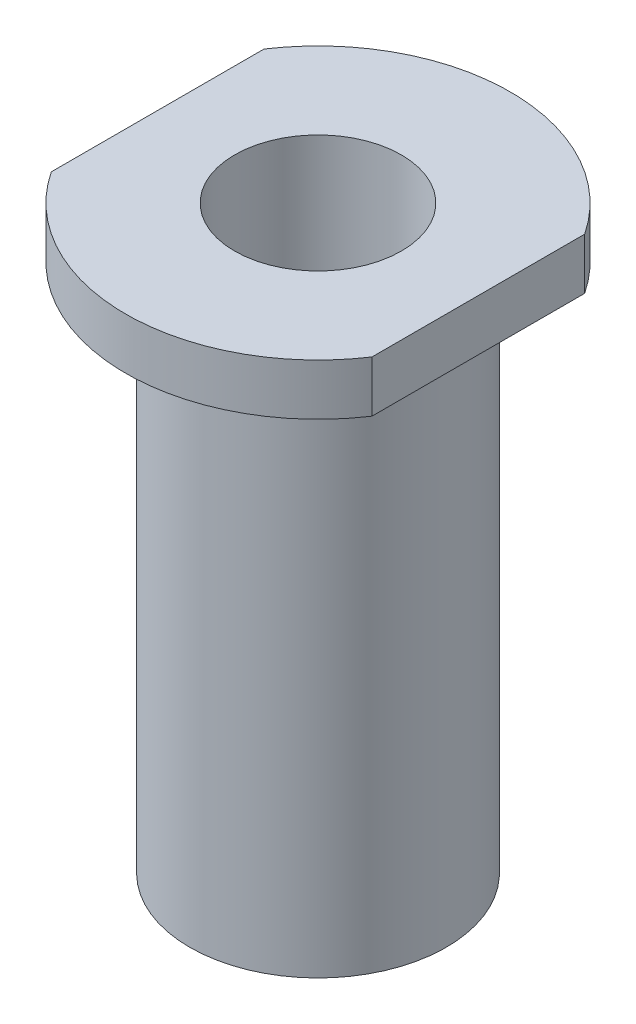
ISO-10303-21;
HEADER;
FILE_DESCRIPTION(('STEP AP214'),'2;1');
FILE_NAME('part.step','',(''),(''),'','','');
FILE_SCHEMA(('AUTOMOTIVE_DESIGN { 1 0 10303 214 1 1 1 1 }'));
ENDSEC;
DATA;
#1=APPLICATION_CONTEXT('core data for automotive mechanical design processes');
#2=APPLICATION_PROTOCOL_DEFINITION('international standard','automotive_design',2000,#1);
#3=PRODUCT_CONTEXT('',#1,'mechanical');
#4=PRODUCT('Part','Part','',(#3));
#5=PRODUCT_RELATED_PRODUCT_CATEGORY('part','',(#4));
#6=PRODUCT_DEFINITION_FORMATION('','',#4);
#7=PRODUCT_DEFINITION_CONTEXT('part definition',#1,'design');
#8=PRODUCT_DEFINITION('design','',#6,#7);
#9=PRODUCT_DEFINITION_SHAPE('','',#8);
#10=(LENGTH_UNIT() NAMED_UNIT(*) SI_UNIT(.MILLI.,.METRE.));
#11=(NAMED_UNIT(*) PLANE_ANGLE_UNIT() SI_UNIT($,.RADIAN.));
#12=(NAMED_UNIT(*) SI_UNIT($,.STERADIAN.) SOLID_ANGLE_UNIT());
#13=UNCERTAINTY_MEASURE_WITH_UNIT(LENGTH_MEASURE(1.E-05),#10,'distance_accuracy_value','');
#14=(GEOMETRIC_REPRESENTATION_CONTEXT(3) GLOBAL_UNCERTAINTY_ASSIGNED_CONTEXT((#13)) GLOBAL_UNIT_ASSIGNED_CONTEXT((#10,
#11,#12)) REPRESENTATION_CONTEXT('',''));
#15=CARTESIAN_POINT('',(0.,0.,0.));
#16=DIRECTION('',(0.,0.,1.));
#17=DIRECTION('',(1.,0.,0.));
#18=AXIS2_PLACEMENT_3D('',#15,#16,#17);
#19=CARTESIAN_POINT('',(0.,22.63,0.));
#20=DIRECTION('',(0.,-1.,0.));
#21=DIRECTION('',(0.,0.,-1.));
#22=AXIS2_PLACEMENT_3D('',#19,#20,#21);
#23=CYLINDRICAL_SURFACE('',#22,5.);
#24=CARTESIAN_POINT('',(0.,0.,0.));
#25=DIRECTION('',(0.,1.,0.));
#26=DIRECTION('',(0.,0.,1.));
#27=AXIS2_PLACEMENT_3D('',#24,#25,#26);
#28=CIRCLE('',#27,5.);
#29=CARTESIAN_POINT('',(0.,0.,5.));
#30=VERTEX_POINT('',#29);
#31=EDGE_CURVE('E54',#30,#30,#28,.T.);
#32=ORIENTED_EDGE('',*,*,#31,.T.);
#33=EDGE_LOOP('',(#32));
#34=FACE_BOUND('',#33,.T.);
#35=CARTESIAN_POINT('',(0.,20.63,0.));
#36=DIRECTION('',(0.,1.,0.));
#37=DIRECTION('',(0.,0.,1.));
#38=AXIS2_PLACEMENT_3D('',#35,#36,#37);
#39=CIRCLE('',#38,5.);
#40=CARTESIAN_POINT('',(0.,20.63,5.));
#41=VERTEX_POINT('',#40);
#42=EDGE_CURVE('E12',#41,#41,#39,.T.);
#43=ORIENTED_EDGE('',*,*,#42,.F.);
#44=EDGE_LOOP('',(#43));
#45=FACE_BOUND('',#44,.T.);
#46=ADVANCED_FACE('F45',(#34,#45),#23,.T.);
#47=CARTESIAN_POINT('',(0.,22.63,0.));
#48=DIRECTION('',(0.,1.,0.));
#49=DIRECTION('',(0.,0.,1.));
#50=AXIS2_PLACEMENT_3D('',#47,#48,#49);
#51=PLANE('',#50);
#52=CARTESIAN_POINT('',(0.,22.63,0.));
#53=DIRECTION('',(0.,1.,0.));
#54=DIRECTION('',(0.,0.,1.));
#55=AXIS2_PLACEMENT_3D('',#52,#53,#54);
#56=CIRCLE('',#55,3.25);
#57=CARTESIAN_POINT('',(0.,22.63,3.25));
#58=VERTEX_POINT('',#57);
#59=EDGE_CURVE('E152',#58,#58,#56,.T.);
#60=ORIENTED_EDGE('',*,*,#59,.F.);
#61=EDGE_LOOP('',(#60));
#62=FACE_BOUND('',#61,.T.);
#63=CARTESIAN_POINT('',(0.,22.63,0.));
#64=DIRECTION('',(0.,1.,0.));
#65=DIRECTION('',(0.,0.,1.));
#66=AXIS2_PLACEMENT_3D('',#63,#64,#65);
#67=CIRCLE('',#66,7.5);
#68=CARTESIAN_POINT('',(6.25,22.63,-4.14578098794425));
#69=VERTEX_POINT('',#68);
#70=CARTESIAN_POINT('',(-6.25,22.63,-4.14578098794425));
#71=VERTEX_POINT('',#70);
#72=EDGE_CURVE('E118',#69,#71,#67,.T.);
#73=ORIENTED_EDGE('',*,*,#72,.T.);
#74=DIRECTION('',(0.,0.,1.));
#75=VECTOR('',#74,1.);
#76=CARTESIAN_POINT('',(-6.25,22.63,4.14578098794425));
#77=LINE('',#76,#75);
#78=CARTESIAN_POINT('',(-6.25,22.63,4.14578098794425));
#79=VERTEX_POINT('',#78);
#80=EDGE_CURVE('E122',#71,#79,#77,.T.);
#81=ORIENTED_EDGE('',*,*,#80,.T.);
#82=CARTESIAN_POINT('',(0.,22.63,0.));
#83=DIRECTION('',(0.,1.,0.));
#84=DIRECTION('',(0.,0.,1.));
#85=AXIS2_PLACEMENT_3D('',#82,#83,#84);
#86=CIRCLE('',#85,7.5);
#87=CARTESIAN_POINT('',(6.25,22.63,4.14578098794425));
#88=VERTEX_POINT('',#87);
#89=EDGE_CURVE('E98',#79,#88,#86,.T.);
#90=ORIENTED_EDGE('',*,*,#89,.T.);
#91=DIRECTION('',(0.,0.,-1.));
#92=VECTOR('',#91,1.);
#93=CARTESIAN_POINT('',(6.25,22.63,4.14578098794425));
#94=LINE('',#93,#92);
#95=EDGE_CURVE('E113',#88,#69,#94,.T.);
#96=ORIENTED_EDGE('',*,*,#95,.T.);
#97=EDGE_LOOP('',(#73,#81,#90,#96));
#98=FACE_BOUND('',#97,.T.);
#99=ADVANCED_FACE('F168',(#62,#98),#51,.T.);
#100=CARTESIAN_POINT('',(0.,0.,0.));
#101=DIRECTION('',(0.,1.,0.));
#102=DIRECTION('',(0.,0.,1.));
#103=AXIS2_PLACEMENT_3D('',#100,#101,#102);
#104=PLANE('',#103);
#105=CARTESIAN_POINT('',(0.,0.,0.));
#106=DIRECTION('',(0.,1.,0.));
#107=DIRECTION('',(0.,0.,1.));
#108=AXIS2_PLACEMENT_3D('',#105,#106,#107);
#109=CIRCLE('',#108,1.5);
#110=CARTESIAN_POINT('',(0.,0.,1.5));
#111=VERTEX_POINT('',#110);
#112=EDGE_CURVE('E137',#111,#111,#109,.T.);
#113=ORIENTED_EDGE('',*,*,#112,.T.);
#114=EDGE_LOOP('',(#113));
#115=FACE_BOUND('',#114,.T.);
#116=ORIENTED_EDGE('',*,*,#31,.F.);
#117=EDGE_LOOP('',(#116));
#118=FACE_BOUND('',#117,.T.);
#119=ADVANCED_FACE('F165',(#115,#118),#104,.F.);
#120=CARTESIAN_POINT('',(0.,12.978,0.));
#121=DIRECTION('',(0.,1.,0.));
#122=DIRECTION('',(0.,0.,1.));
#123=AXIS2_PLACEMENT_3D('',#120,#121,#122);
#124=CYLINDRICAL_SURFACE('',#123,3.25);
#125=CARTESIAN_POINT('',(0.,12.978,0.));
#126=DIRECTION('',(0.,1.,0.));
#127=DIRECTION('',(0.,0.,1.));
#128=AXIS2_PLACEMENT_3D('',#125,#126,#127);
#129=CIRCLE('',#128,3.25);
#130=CARTESIAN_POINT('',(0.,12.978,3.25));
#131=VERTEX_POINT('',#130);
#132=EDGE_CURVE('E153',#131,#131,#129,.T.);
#133=ORIENTED_EDGE('',*,*,#132,.F.);
#134=EDGE_LOOP('',(#133));
#135=FACE_BOUND('',#134,.T.);
#136=ORIENTED_EDGE('',*,*,#59,.T.);
#137=EDGE_LOOP('',(#136));
#138=FACE_BOUND('',#137,.T.);
#139=ADVANCED_FACE('F167',(#135,#138),#124,.F.);
#140=CARTESIAN_POINT('',(0.,12.978,0.));
#141=DIRECTION('',(0.,1.,0.));
#142=DIRECTION('',(0.,0.,1.));
#143=AXIS2_PLACEMENT_3D('',#140,#141,#142);
#144=PLANE('',#143);
#145=CARTESIAN_POINT('',(0.,12.978,0.));
#146=DIRECTION('',(0.,1.,0.));
#147=DIRECTION('',(0.,0.,1.));
#148=AXIS2_PLACEMENT_3D('',#145,#146,#147);
#149=CIRCLE('',#148,2.5);
#150=CARTESIAN_POINT('',(0.,12.978,2.5));
#151=VERTEX_POINT('',#150);
#152=EDGE_CURVE('E141',#151,#151,#149,.T.);
#153=ORIENTED_EDGE('',*,*,#152,.F.);
#154=EDGE_LOOP('',(#153));
#155=FACE_BOUND('',#154,.T.);
#156=ORIENTED_EDGE('',*,*,#132,.T.);
#157=EDGE_LOOP('',(#156));
#158=FACE_BOUND('',#157,.T.);
#159=ADVANCED_FACE('F174',(#155,#158),#144,.T.);
#160=CARTESIAN_POINT('',(0.,-7.07106781186547,0.));
#161=DIRECTION('',(0.,1.,0.));
#162=DIRECTION('',(0.,0.,1.));
#163=AXIS2_PLACEMENT_3D('',#160,#161,#162);
#164=CYLINDRICAL_SURFACE('',#163,2.5);
#165=CARTESIAN_POINT('',(0.,3.,0.));
#166=DIRECTION('',(0.,1.,0.));
#167=DIRECTION('',(0.,0.,1.));
#168=AXIS2_PLACEMENT_3D('',#165,#166,#167);
#169=CIRCLE('',#168,2.5);
#170=CARTESIAN_POINT('',(0.,3.,2.5));
#171=VERTEX_POINT('',#170);
#172=EDGE_CURVE('E148',#171,#171,#169,.F.);
#173=ORIENTED_EDGE('',*,*,#172,.T.);
#174=EDGE_LOOP('',(#173));
#175=FACE_BOUND('',#174,.T.);
#176=ORIENTED_EDGE('',*,*,#152,.T.);
#177=EDGE_LOOP('',(#176));
#178=FACE_BOUND('',#177,.T.);
#179=ADVANCED_FACE('F264',(#175,#178),#164,.F.);
#180=CARTESIAN_POINT('',(0.,3.,0.));
#181=DIRECTION('',(0.,1.,0.));
#182=DIRECTION('',(0.,0.,1.));
#183=AXIS2_PLACEMENT_3D('',#180,#181,#182);
#184=PLANE('',#183);
#185=CARTESIAN_POINT('',(0.,3.,0.));
#186=DIRECTION('',(0.,1.,0.));
#187=DIRECTION('',(0.,0.,1.));
#188=AXIS2_PLACEMENT_3D('',#185,#186,#187);
#189=CIRCLE('',#188,1.5);
#190=CARTESIAN_POINT('',(0.,3.,1.5));
#191=VERTEX_POINT('',#190);
#192=EDGE_CURVE('E132',#191,#191,#189,.T.);
#193=ORIENTED_EDGE('',*,*,#192,.F.);
#194=EDGE_LOOP('',(#193));
#195=FACE_BOUND('',#194,.T.);
#196=ORIENTED_EDGE('',*,*,#172,.F.);
#197=EDGE_LOOP('',(#196));
#198=FACE_BOUND('',#197,.T.);
#199=ADVANCED_FACE('F255',(#195,#198),#184,.T.);
#200=CARTESIAN_POINT('',(0.,0.,0.));
#201=DIRECTION('',(0.,1.,0.));
#202=DIRECTION('',(0.,0.,1.));
#203=AXIS2_PLACEMENT_3D('',#200,#201,#202);
#204=CYLINDRICAL_SURFACE('',#203,1.5);
#205=ORIENTED_EDGE('',*,*,#112,.F.);
#206=EDGE_LOOP('',(#205));
#207=FACE_BOUND('',#206,.T.);
#208=ORIENTED_EDGE('',*,*,#192,.T.);
#209=EDGE_LOOP('',(#208));
#210=FACE_BOUND('',#209,.T.);
#211=ADVANCED_FACE('F200',(#207,#210),#204,.F.);
#212=CARTESIAN_POINT('',(0.,20.63,0.));
#213=DIRECTION('',(0.,1.,0.));
#214=DIRECTION('',(0.,0.,1.));
#215=AXIS2_PLACEMENT_3D('',#212,#213,#214);
#216=CYLINDRICAL_SURFACE('',#215,7.5);
#217=ORIENTED_EDGE('',*,*,#72,.F.);
#218=DIRECTION('',(0.,1.,0.));
#219=VECTOR('',#218,1.);
#220=CARTESIAN_POINT('',(6.25,20.63,-4.14578098794425));
#221=LINE('',#220,#219);
#222=CARTESIAN_POINT('',(6.25,20.63,-4.14578098794425));
#223=VERTEX_POINT('',#222);
#224=EDGE_CURVE('E62',#223,#69,#221,.T.);
#225=ORIENTED_EDGE('',*,*,#224,.F.);
#226=CARTESIAN_POINT('',(0.,20.63,0.));
#227=DIRECTION('',(0.,1.,0.));
#228=DIRECTION('',(0.,0.,1.));
#229=AXIS2_PLACEMENT_3D('',#226,#227,#228);
#230=CIRCLE('',#229,7.5);
#231=CARTESIAN_POINT('',(-6.25,20.63,-4.14578098794425));
#232=VERTEX_POINT('',#231);
#233=EDGE_CURVE('E110',#223,#232,#230,.T.);
#234=ORIENTED_EDGE('',*,*,#233,.T.);
#235=DIRECTION('',(0.,1.,0.));
#236=VECTOR('',#235,1.);
#237=CARTESIAN_POINT('',(-6.25,20.63,-4.14578098794425));
#238=LINE('',#237,#236);
#239=EDGE_CURVE('E90',#232,#71,#238,.T.);
#240=ORIENTED_EDGE('',*,*,#239,.T.);
#241=EDGE_LOOP('',(#217,#225,#234,#240));
#242=FACE_BOUND('',#241,.T.);
#243=ADVANCED_FACE('F195',(#242),#216,.T.);
#244=CARTESIAN_POINT('',(6.25,20.63,4.14578098794425));
#245=DIRECTION('',(1.,0.,0.));
#246=DIRECTION('',(0.,0.,-1.));
#247=AXIS2_PLACEMENT_3D('',#244,#245,#246);
#248=PLANE('',#247);
#249=ORIENTED_EDGE('',*,*,#95,.F.);
#250=DIRECTION('',(0.,1.,0.));
#251=VECTOR('',#250,1.);
#252=CARTESIAN_POINT('',(6.25,20.63,4.14578098794425));
#253=LINE('',#252,#251);
#254=CARTESIAN_POINT('',(6.25,20.63,4.14578098794425));
#255=VERTEX_POINT('',#254);
#256=EDGE_CURVE('E79',#255,#88,#253,.T.);
#257=ORIENTED_EDGE('',*,*,#256,.F.);
#258=DIRECTION('',(0.,0.,-1.));
#259=VECTOR('',#258,1.);
#260=CARTESIAN_POINT('',(6.25,20.63,4.14578098794425));
#261=LINE('',#260,#259);
#262=EDGE_CURVE('E105',#255,#223,#261,.T.);
#263=ORIENTED_EDGE('',*,*,#262,.T.);
#264=ORIENTED_EDGE('',*,*,#224,.T.);
#265=EDGE_LOOP('',(#249,#257,#263,#264));
#266=FACE_BOUND('',#265,.T.);
#267=ADVANCED_FACE('F199',(#266),#248,.T.);
#268=CARTESIAN_POINT('',(0.,20.63,0.));
#269=DIRECTION('',(0.,1.,0.));
#270=DIRECTION('',(0.,0.,1.));
#271=AXIS2_PLACEMENT_3D('',#268,#269,#270);
#272=CYLINDRICAL_SURFACE('',#271,7.5);
#273=ORIENTED_EDGE('',*,*,#89,.F.);
#274=DIRECTION('',(0.,1.,0.));
#275=VECTOR('',#274,1.);
#276=CARTESIAN_POINT('',(-6.25,20.63,4.14578098794425));
#277=LINE('',#276,#275);
#278=CARTESIAN_POINT('',(-6.25,20.63,4.14578098794425));
#279=VERTEX_POINT('',#278);
#280=EDGE_CURVE('E93',#279,#79,#277,.T.);
#281=ORIENTED_EDGE('',*,*,#280,.F.);
#282=CARTESIAN_POINT('',(0.,20.63,0.));
#283=DIRECTION('',(0.,1.,0.));
#284=DIRECTION('',(0.,0.,1.));
#285=AXIS2_PLACEMENT_3D('',#282,#283,#284);
#286=CIRCLE('',#285,7.5);
#287=EDGE_CURVE('E96',#279,#255,#286,.T.);
#288=ORIENTED_EDGE('',*,*,#287,.T.);
#289=ORIENTED_EDGE('',*,*,#256,.T.);
#290=EDGE_LOOP('',(#273,#281,#288,#289));
#291=FACE_BOUND('',#290,.T.);
#292=ADVANCED_FACE('F95',(#291),#272,.T.);
#293=CARTESIAN_POINT('',(-6.25,20.63,4.14578098794425));
#294=DIRECTION('',(-1.,0.,0.));
#295=DIRECTION('',(0.,0.,1.));
#296=AXIS2_PLACEMENT_3D('',#293,#294,#295);
#297=PLANE('',#296);
#298=ORIENTED_EDGE('',*,*,#80,.F.);
#299=ORIENTED_EDGE('',*,*,#239,.F.);
#300=DIRECTION('',(0.,0.,1.));
#301=VECTOR('',#300,1.);
#302=CARTESIAN_POINT('',(-6.25,20.63,4.14578098794425));
#303=LINE('',#302,#301);
#304=EDGE_CURVE('E104',#232,#279,#303,.T.);
#305=ORIENTED_EDGE('',*,*,#304,.T.);
#306=ORIENTED_EDGE('',*,*,#280,.T.);
#307=EDGE_LOOP('',(#298,#299,#305,#306));
#308=FACE_BOUND('',#307,.T.);
#309=ADVANCED_FACE('F108',(#308),#297,.T.);
#310=CARTESIAN_POINT('',(0.,20.63,0.));
#311=DIRECTION('',(0.,1.,0.));
#312=DIRECTION('',(0.,0.,1.));
#313=AXIS2_PLACEMENT_3D('',#310,#311,#312);
#314=PLANE('',#313);
#315=ORIENTED_EDGE('',*,*,#42,.T.);
#316=EDGE_LOOP('',(#315));
#317=FACE_BOUND('',#316,.T.);
#318=ORIENTED_EDGE('',*,*,#233,.F.);
#319=ORIENTED_EDGE('',*,*,#262,.F.);
#320=ORIENTED_EDGE('',*,*,#287,.F.);
#321=ORIENTED_EDGE('',*,*,#304,.F.);
#322=EDGE_LOOP('',(#318,#319,#320,#321));
#323=FACE_BOUND('',#322,.T.);
#324=ADVANCED_FACE('F103',(#317,#323),#314,.F.);
#325=CLOSED_SHELL('',(#46,#99,#119,#139,#159,#179,#199,#211,#243,#267,#292,#309,#324));
#326=MANIFOLD_SOLID_BREP('B2',#325);
#327=ADVANCED_BREP_SHAPE_REPRESENTATION('',(#18,#326),#14);
#328=SHAPE_DEFINITION_REPRESENTATION(#9,#327);
ENDSEC;
END-ISO-10303-21;
